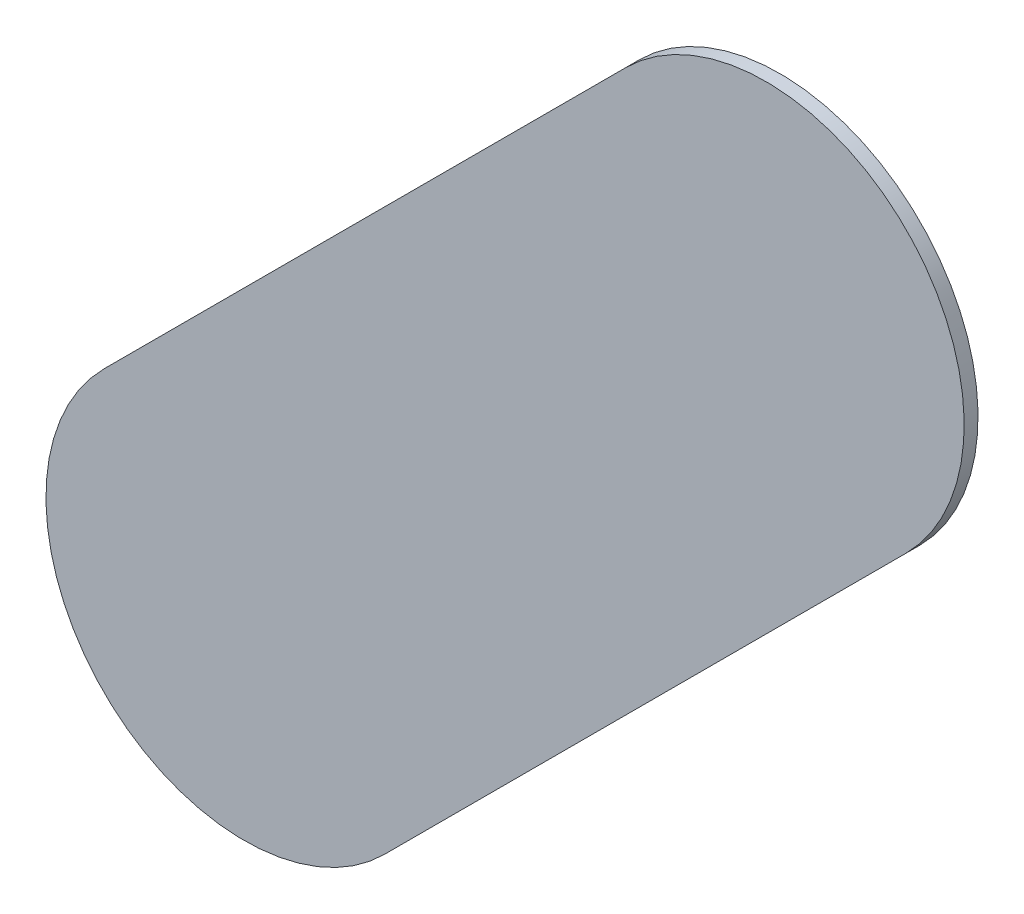
ISO-10303-21;
HEADER;
FILE_DESCRIPTION(('STEP AP214'),'2;1');
FILE_NAME('part.step','',(''),(''),'','','');
FILE_SCHEMA(('AUTOMOTIVE_DESIGN { 1 0 10303 214 1 1 1 1 }'));
ENDSEC;
DATA;
#1=APPLICATION_CONTEXT('core data for automotive mechanical design processes');
#2=APPLICATION_PROTOCOL_DEFINITION('international standard','automotive_design',2000,#1);
#3=PRODUCT_CONTEXT('',#1,'mechanical');
#4=PRODUCT('Part','Part','',(#3));
#5=PRODUCT_RELATED_PRODUCT_CATEGORY('part','',(#4));
#6=PRODUCT_DEFINITION_FORMATION('','',#4);
#7=PRODUCT_DEFINITION_CONTEXT('part definition',#1,'design');
#8=PRODUCT_DEFINITION('design','',#6,#7);
#9=PRODUCT_DEFINITION_SHAPE('','',#8);
#10=(LENGTH_UNIT() NAMED_UNIT(*) SI_UNIT(.MILLI.,.METRE.));
#11=(NAMED_UNIT(*) PLANE_ANGLE_UNIT() SI_UNIT($,.RADIAN.));
#12=(NAMED_UNIT(*) SI_UNIT($,.STERADIAN.) SOLID_ANGLE_UNIT());
#13=UNCERTAINTY_MEASURE_WITH_UNIT(LENGTH_MEASURE(1.E-05),#10,'distance_accuracy_value','');
#14=(GEOMETRIC_REPRESENTATION_CONTEXT(3) GLOBAL_UNCERTAINTY_ASSIGNED_CONTEXT((#13)) GLOBAL_UNIT_ASSIGNED_CONTEXT((#10,
#11,#12)) REPRESENTATION_CONTEXT('',''));
#15=CARTESIAN_POINT('',(0.,0.,0.));
#16=DIRECTION('',(0.,0.,1.));
#17=DIRECTION('',(1.,0.,0.));
#18=AXIS2_PLACEMENT_3D('',#15,#16,#17);
#19=CARTESIAN_POINT('',(123.097553,-95.149553,1.635));
#20=DIRECTION('',(0.,0.,1.));
#21=DIRECTION('',(1.,0.,0.));
#22=AXIS2_PLACEMENT_3D('',#19,#20,#21);
#23=PLANE('',#22);
#24=DIRECTION('',(0.707106781186548,0.707106781186548,0.));
#25=VECTOR('',#24,1.);
#26=CARTESIAN_POINT('',(123.097553,-95.149553,1.635));
#27=LINE('',#26,#25);
#28=CARTESIAN_POINT('',(123.097553,-95.149553,1.635));
#29=VERTEX_POINT('',#28);
#30=CARTESIAN_POINT('',(124.413553,-93.833553,1.635));
#31=VERTEX_POINT('',#30);
#32=EDGE_CURVE('E98',#29,#31,#27,.T.);
#33=ORIENTED_EDGE('',*,*,#32,.T.);
#34=CARTESIAN_POINT('',(124.0599995,-93.4799995,1.635));
#35=DIRECTION('',(0.,0.,1.));
#36=DIRECTION('',(0.707106781186548,-0.707106781186548,0.));
#37=AXIS2_PLACEMENT_3D('',#34,#35,#36);
#38=CIRCLE('',#37,0.500000154724);
#39=CARTESIAN_POINT('',(123.706446,-93.126446,1.635));
#40=VERTEX_POINT('',#39);
#41=EDGE_CURVE('E78',#31,#40,#38,.T.);
#42=ORIENTED_EDGE('',*,*,#41,.T.);
#43=DIRECTION('',(-0.707106781186548,-0.707106781186548,0.));
#44=VECTOR('',#43,1.);
#45=CARTESIAN_POINT('',(123.706446,-93.126446,1.635));
#46=LINE('',#45,#44);
#47=CARTESIAN_POINT('',(122.390446,-94.442446,1.635));
#48=VERTEX_POINT('',#47);
#49=EDGE_CURVE('E82',#40,#48,#46,.T.);
#50=ORIENTED_EDGE('',*,*,#49,.T.);
#51=CARTESIAN_POINT('',(122.7439995,-94.7959995,1.635));
#52=DIRECTION('',(0.,0.,1.));
#53=DIRECTION('',(-0.707106781186548,0.707106781186548,0.));
#54=AXIS2_PLACEMENT_3D('',#51,#52,#53);
#55=CIRCLE('',#54,0.500000154724);
#56=EDGE_CURVE('E11',#48,#29,#55,.T.);
#57=ORIENTED_EDGE('',*,*,#56,.T.);
#58=EDGE_LOOP('',(#33,#42,#50,#57));
#59=FACE_BOUND('',#58,.T.);
#60=ADVANCED_FACE('F17',(#59),#23,.T.);
#61=CARTESIAN_POINT('',(123.097553,-95.149553,1.6));
#62=DIRECTION('',(0.,0.,1.));
#63=DIRECTION('',(1.,0.,0.));
#64=AXIS2_PLACEMENT_3D('',#61,#62,#63);
#65=PLANE('',#64);
#66=CARTESIAN_POINT('',(122.7439995,-94.7959995,1.6));
#67=DIRECTION('',(0.,0.,1.));
#68=DIRECTION('',(-0.707106781186548,0.707106781186548,0.));
#69=AXIS2_PLACEMENT_3D('',#66,#67,#68);
#70=CIRCLE('',#69,0.500000154724);
#71=CARTESIAN_POINT('',(122.390446,-94.442446,1.6));
#72=VERTEX_POINT('',#71);
#73=CARTESIAN_POINT('',(123.097553,-95.149553,1.6));
#74=VERTEX_POINT('',#73);
#75=EDGE_CURVE('E26',#72,#74,#70,.T.);
#76=ORIENTED_EDGE('',*,*,#75,.F.);
#77=DIRECTION('',(-0.707106781186548,-0.707106781186548,0.));
#78=VECTOR('',#77,1.);
#79=CARTESIAN_POINT('',(123.706446,-93.126446,1.6));
#80=LINE('',#79,#78);
#81=CARTESIAN_POINT('',(123.706446,-93.126446,1.6));
#82=VERTEX_POINT('',#81);
#83=EDGE_CURVE('E20',#82,#72,#80,.T.);
#84=ORIENTED_EDGE('',*,*,#83,.F.);
#85=CARTESIAN_POINT('',(124.0599995,-93.4799995,1.6));
#86=DIRECTION('',(0.,0.,1.));
#87=DIRECTION('',(0.707106781186548,-0.707106781186548,0.));
#88=AXIS2_PLACEMENT_3D('',#85,#86,#87);
#89=CIRCLE('',#88,0.500000154724);
#90=CARTESIAN_POINT('',(124.413553,-93.833553,1.6));
#91=VERTEX_POINT('',#90);
#92=EDGE_CURVE('E72',#91,#82,#89,.T.);
#93=ORIENTED_EDGE('',*,*,#92,.F.);
#94=DIRECTION('',(0.707106781186548,0.707106781186548,0.));
#95=VECTOR('',#94,1.);
#96=CARTESIAN_POINT('',(123.097553,-95.149553,1.6));
#97=LINE('',#96,#95);
#98=EDGE_CURVE('E121',#74,#91,#97,.T.);
#99=ORIENTED_EDGE('',*,*,#98,.F.);
#100=EDGE_LOOP('',(#76,#84,#93,#99));
#101=FACE_BOUND('',#100,.T.);
#102=ADVANCED_FACE('F70',(#101),#65,.F.);
#103=CARTESIAN_POINT('',(122.7439995,-94.7959995,1.6));
#104=DIRECTION('',(0.,0.,-1.));
#105=DIRECTION('',(-0.707106781186548,0.707106781186548,0.));
#106=AXIS2_PLACEMENT_3D('',#103,#104,#105);
#107=CYLINDRICAL_SURFACE('',#106,0.500000154724);
#108=ORIENTED_EDGE('',*,*,#75,.T.);
#109=DIRECTION('',(0.,0.,1.));
#110=VECTOR('',#109,1.);
#111=CARTESIAN_POINT('',(123.097553,-95.149553,1.6));
#112=LINE('',#111,#110);
#113=EDGE_CURVE('E92',#74,#29,#112,.T.);
#114=ORIENTED_EDGE('',*,*,#113,.T.);
#115=ORIENTED_EDGE('',*,*,#56,.F.);
#116=DIRECTION('',(0.,0.,1.));
#117=VECTOR('',#116,1.);
#118=CARTESIAN_POINT('',(122.390446,-94.442446,1.6));
#119=LINE('',#118,#117);
#120=EDGE_CURVE('E77',#72,#48,#119,.T.);
#121=ORIENTED_EDGE('',*,*,#120,.F.);
#122=EDGE_LOOP('',(#108,#114,#115,#121));
#123=FACE_BOUND('',#122,.T.);
#124=ADVANCED_FACE('F130',(#123),#107,.T.);
#125=CARTESIAN_POINT('',(123.706446,-93.126446,1.6));
#126=DIRECTION('',(0.707106781186548,-0.707106781186548,0.));
#127=DIRECTION('',(0.,0.,-1.));
#128=AXIS2_PLACEMENT_3D('',#125,#126,#127);
#129=PLANE('',#128);
#130=ORIENTED_EDGE('',*,*,#83,.T.);
#131=ORIENTED_EDGE('',*,*,#120,.T.);
#132=ORIENTED_EDGE('',*,*,#49,.F.);
#133=DIRECTION('',(0.,0.,1.));
#134=VECTOR('',#133,1.);
#135=CARTESIAN_POINT('',(123.706446,-93.126446,1.6));
#136=LINE('',#135,#134);
#137=EDGE_CURVE('E80',#82,#40,#136,.T.);
#138=ORIENTED_EDGE('',*,*,#137,.F.);
#139=EDGE_LOOP('',(#130,#131,#132,#138));
#140=FACE_BOUND('',#139,.T.);
#141=ADVANCED_FACE('F81',(#140),#129,.F.);
#142=CARTESIAN_POINT('',(124.0599995,-93.4799995,1.6));
#143=DIRECTION('',(0.,0.,-1.));
#144=DIRECTION('',(0.707106781186548,-0.707106781186548,0.));
#145=AXIS2_PLACEMENT_3D('',#142,#143,#144);
#146=CYLINDRICAL_SURFACE('',#145,0.500000154724);
#147=ORIENTED_EDGE('',*,*,#92,.T.);
#148=ORIENTED_EDGE('',*,*,#137,.T.);
#149=ORIENTED_EDGE('',*,*,#41,.F.);
#150=DIRECTION('',(0.,0.,1.));
#151=VECTOR('',#150,1.);
#152=CARTESIAN_POINT('',(124.413553,-93.833553,1.6));
#153=LINE('',#152,#151);
#154=EDGE_CURVE('E89',#91,#31,#153,.T.);
#155=ORIENTED_EDGE('',*,*,#154,.F.);
#156=EDGE_LOOP('',(#147,#148,#149,#155));
#157=FACE_BOUND('',#156,.T.);
#158=ADVANCED_FACE('F87',(#157),#146,.T.);
#159=CARTESIAN_POINT('',(123.097553,-95.149553,1.6));
#160=DIRECTION('',(-0.707106781186548,0.707106781186548,0.));
#161=DIRECTION('',(0.,0.,1.));
#162=AXIS2_PLACEMENT_3D('',#159,#160,#161);
#163=PLANE('',#162);
#164=ORIENTED_EDGE('',*,*,#98,.T.);
#165=ORIENTED_EDGE('',*,*,#154,.T.);
#166=ORIENTED_EDGE('',*,*,#32,.F.);
#167=ORIENTED_EDGE('',*,*,#113,.F.);
#168=EDGE_LOOP('',(#164,#165,#166,#167));
#169=FACE_BOUND('',#168,.T.);
#170=ADVANCED_FACE('F129',(#169),#163,.F.);
#171=CLOSED_SHELL('',(#60,#102,#124,#141,#158,#170));
#172=MANIFOLD_SOLID_BREP('B1',#171);
#173=ADVANCED_BREP_SHAPE_REPRESENTATION('',(#18,#172),#14);
#174=SHAPE_DEFINITION_REPRESENTATION(#9,#173);
ENDSEC;
END-ISO-10303-21;
